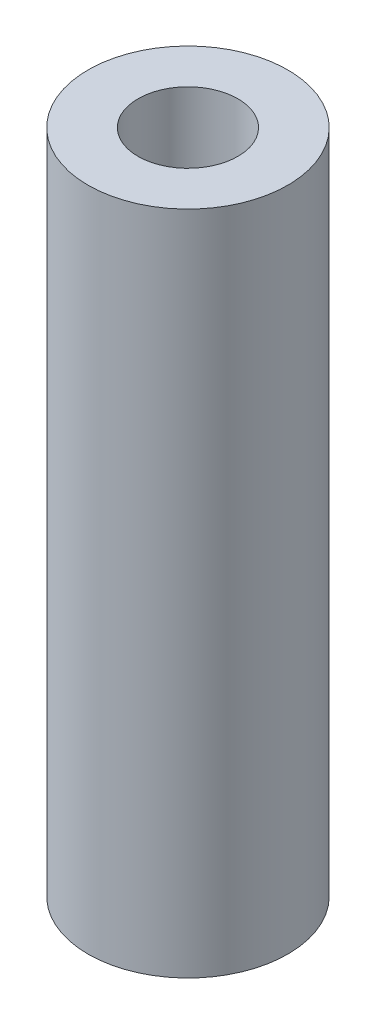
ISO-10303-21;
HEADER;
FILE_DESCRIPTION(('STEP AP214'),'2;1');
FILE_NAME('part.step','',(''),(''),'','','');
FILE_SCHEMA(('AUTOMOTIVE_DESIGN { 1 0 10303 214 1 1 1 1 }'));
ENDSEC;
DATA;
#1=APPLICATION_CONTEXT('core data for automotive mechanical design processes');
#2=APPLICATION_PROTOCOL_DEFINITION('international standard','automotive_design',2000,#1);
#3=PRODUCT_CONTEXT('',#1,'mechanical');
#4=PRODUCT('Part','Part','',(#3));
#5=PRODUCT_RELATED_PRODUCT_CATEGORY('part','',(#4));
#6=PRODUCT_DEFINITION_FORMATION('','',#4);
#7=PRODUCT_DEFINITION_CONTEXT('part definition',#1,'design');
#8=PRODUCT_DEFINITION('design','',#6,#7);
#9=PRODUCT_DEFINITION_SHAPE('','',#8);
#10=(LENGTH_UNIT() NAMED_UNIT(*) SI_UNIT(.MILLI.,.METRE.));
#11=(NAMED_UNIT(*) PLANE_ANGLE_UNIT() SI_UNIT($,.RADIAN.));
#12=(NAMED_UNIT(*) SI_UNIT($,.STERADIAN.) SOLID_ANGLE_UNIT());
#13=UNCERTAINTY_MEASURE_WITH_UNIT(LENGTH_MEASURE(1.E-05),#10,'distance_accuracy_value','');
#14=(GEOMETRIC_REPRESENTATION_CONTEXT(3) GLOBAL_UNCERTAINTY_ASSIGNED_CONTEXT((#13)) GLOBAL_UNIT_ASSIGNED_CONTEXT((#10,
#11,#12)) REPRESENTATION_CONTEXT('',''));
#15=CARTESIAN_POINT('',(0.,0.,0.));
#16=DIRECTION('',(0.,0.,1.));
#17=DIRECTION('',(1.,0.,0.));
#18=AXIS2_PLACEMENT_3D('',#15,#16,#17);
#19=CARTESIAN_POINT('',(0.,20.,0.));
#20=DIRECTION('',(0.,1.,0.));
#21=DIRECTION('',(0.,0.,1.));
#22=AXIS2_PLACEMENT_3D('',#19,#20,#21);
#23=PLANE('',#22);
#24=CARTESIAN_POINT('',(0.,20.,0.));
#25=DIRECTION('',(0.,1.,0.));
#26=DIRECTION('',(0.,0.,1.));
#27=AXIS2_PLACEMENT_3D('',#24,#25,#26);
#28=CIRCLE('',#27,3.);
#29=CARTESIAN_POINT('',(0.,20.,3.));
#30=VERTEX_POINT('',#29);
#31=EDGE_CURVE('E10',#30,#30,#28,.T.);
#32=ORIENTED_EDGE('',*,*,#31,.T.);
#33=EDGE_LOOP('',(#32));
#34=FACE_BOUND('',#33,.T.);
#35=CARTESIAN_POINT('',(0.,20.,0.));
#36=DIRECTION('',(0.,1.,0.));
#37=DIRECTION('',(0.,0.,1.));
#38=AXIS2_PLACEMENT_3D('',#35,#36,#37);
#39=CIRCLE('',#38,1.5);
#40=CARTESIAN_POINT('',(0.,20.,1.5));
#41=VERTEX_POINT('',#40);
#42=EDGE_CURVE('E50',#41,#41,#39,.T.);
#43=ORIENTED_EDGE('',*,*,#42,.F.);
#44=EDGE_LOOP('',(#43));
#45=FACE_BOUND('',#44,.T.);
#46=ADVANCED_FACE('F39',(#34,#45),#23,.T.);
#47=CARTESIAN_POINT('',(0.,0.,0.));
#48=DIRECTION('',(0.,1.,0.));
#49=DIRECTION('',(0.,0.,1.));
#50=AXIS2_PLACEMENT_3D('',#47,#48,#49);
#51=PLANE('',#50);
#52=CARTESIAN_POINT('',(0.,0.,0.));
#53=DIRECTION('',(0.,1.,0.));
#54=DIRECTION('',(0.,0.,1.));
#55=AXIS2_PLACEMENT_3D('',#52,#53,#54);
#56=CIRCLE('',#55,3.);
#57=CARTESIAN_POINT('',(0.,0.,3.));
#58=VERTEX_POINT('',#57);
#59=EDGE_CURVE('E43',#58,#58,#56,.T.);
#60=ORIENTED_EDGE('',*,*,#59,.F.);
#61=EDGE_LOOP('',(#60));
#62=FACE_BOUND('',#61,.T.);
#63=CARTESIAN_POINT('',(0.,0.,0.));
#64=DIRECTION('',(0.,1.,0.));
#65=DIRECTION('',(0.,0.,1.));
#66=AXIS2_PLACEMENT_3D('',#63,#64,#65);
#67=CIRCLE('',#66,1.5);
#68=CARTESIAN_POINT('',(0.,0.,1.5));
#69=VERTEX_POINT('',#68);
#70=EDGE_CURVE('E52',#69,#69,#67,.T.);
#71=ORIENTED_EDGE('',*,*,#70,.T.);
#72=EDGE_LOOP('',(#71));
#73=FACE_BOUND('',#72,.T.);
#74=ADVANCED_FACE('F62',(#62,#73),#51,.F.);
#75=CARTESIAN_POINT('',(0.,20.,0.));
#76=DIRECTION('',(0.,-1.,0.));
#77=DIRECTION('',(0.,0.,-1.));
#78=AXIS2_PLACEMENT_3D('',#75,#76,#77);
#79=CYLINDRICAL_SURFACE('',#78,3.);
#80=ORIENTED_EDGE('',*,*,#31,.F.);
#81=EDGE_LOOP('',(#80));
#82=FACE_BOUND('',#81,.T.);
#83=ORIENTED_EDGE('',*,*,#59,.T.);
#84=EDGE_LOOP('',(#83));
#85=FACE_BOUND('',#84,.T.);
#86=ADVANCED_FACE('F41',(#82,#85),#79,.T.);
#87=CARTESIAN_POINT('',(0.,20.,0.));
#88=DIRECTION('',(0.,-1.,0.));
#89=DIRECTION('',(0.,0.,-1.));
#90=AXIS2_PLACEMENT_3D('',#87,#88,#89);
#91=CYLINDRICAL_SURFACE('',#90,1.5);
#92=ORIENTED_EDGE('',*,*,#42,.T.);
#93=EDGE_LOOP('',(#92));
#94=FACE_BOUND('',#93,.T.);
#95=ORIENTED_EDGE('',*,*,#70,.F.);
#96=EDGE_LOOP('',(#95));
#97=FACE_BOUND('',#96,.T.);
#98=ADVANCED_FACE('F58',(#94,#97),#91,.F.);
#99=CLOSED_SHELL('',(#46,#74,#86,#98));
#100=MANIFOLD_SOLID_BREP('B2',#99);
#101=ADVANCED_BREP_SHAPE_REPRESENTATION('',(#18,#100),#14);
#102=SHAPE_DEFINITION_REPRESENTATION(#9,#101);
ENDSEC;
END-ISO-10303-21;
